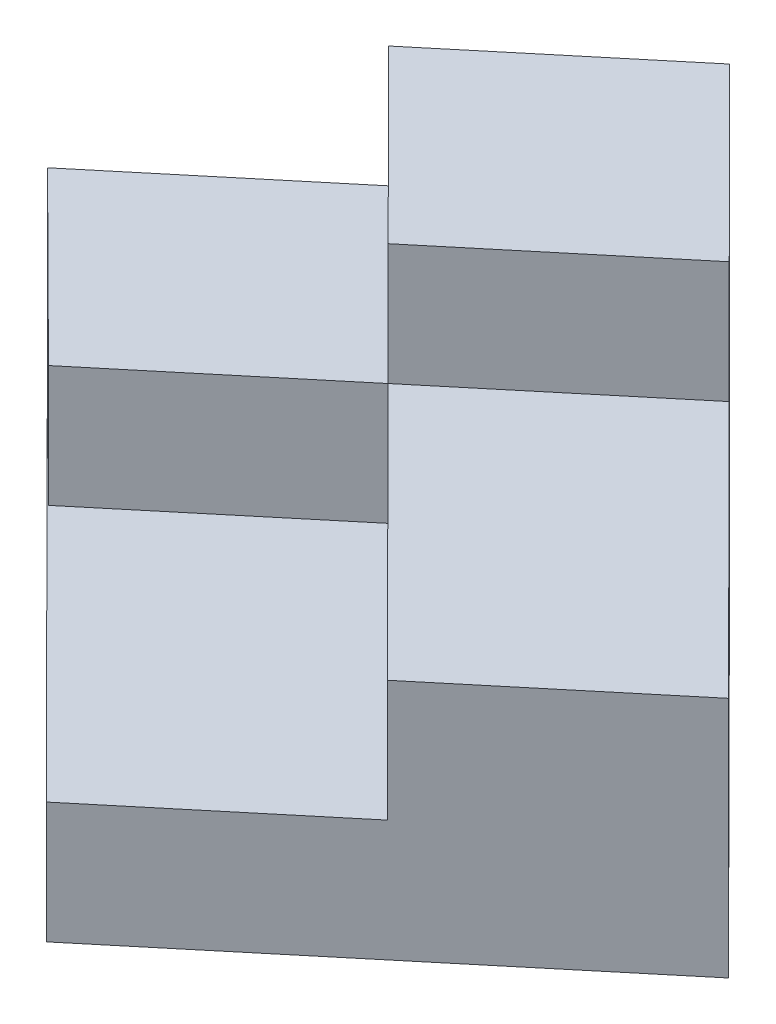
ISO-10303-21;
HEADER;
FILE_DESCRIPTION(('STEP AP214'),'2;1');
FILE_NAME('part.step','',(''),(''),'','','');
FILE_SCHEMA(('AUTOMOTIVE_DESIGN { 1 0 10303 214 1 1 1 1 }'));
ENDSEC;
DATA;
#1=APPLICATION_CONTEXT('core data for automotive mechanical design processes');
#2=APPLICATION_PROTOCOL_DEFINITION('international standard','automotive_design',2000,#1);
#3=PRODUCT_CONTEXT('',#1,'mechanical');
#4=PRODUCT('Part','Part','',(#3));
#5=PRODUCT_RELATED_PRODUCT_CATEGORY('part','',(#4));
#6=PRODUCT_DEFINITION_FORMATION('','',#4);
#7=PRODUCT_DEFINITION_CONTEXT('part definition',#1,'design');
#8=PRODUCT_DEFINITION('design','',#6,#7);
#9=PRODUCT_DEFINITION_SHAPE('','',#8);
#10=(LENGTH_UNIT() NAMED_UNIT(*) SI_UNIT(.MILLI.,.METRE.));
#11=(NAMED_UNIT(*) PLANE_ANGLE_UNIT() SI_UNIT($,.RADIAN.));
#12=(NAMED_UNIT(*) SI_UNIT($,.STERADIAN.) SOLID_ANGLE_UNIT());
#13=UNCERTAINTY_MEASURE_WITH_UNIT(LENGTH_MEASURE(1.E-05),#10,'distance_accuracy_value','');
#14=(GEOMETRIC_REPRESENTATION_CONTEXT(3) GLOBAL_UNCERTAINTY_ASSIGNED_CONTEXT((#13)) GLOBAL_UNIT_ASSIGNED_CONTEXT((#10,
#11,#12)) REPRESENTATION_CONTEXT('',''));
#15=CARTESIAN_POINT('',(0.,0.,0.));
#16=DIRECTION('',(0.,0.,1.));
#17=DIRECTION('',(1.,0.,0.));
#18=AXIS2_PLACEMENT_3D('',#15,#16,#17);
#19=CARTESIAN_POINT('',(0.,10.,0.));
#20=DIRECTION('',(0.,1.,0.));
#21=DIRECTION('',(0.,0.,1.));
#22=AXIS2_PLACEMENT_3D('',#19,#20,#21);
#23=PLANE('',#22);
#24=DIRECTION('',(0.768750532261941,0.,-0.639548762133883));
#25=VECTOR('',#24,1.);
#26=CARTESIAN_POINT('',(35.3021332217309,10.,35.4084649483024));
#27=LINE('',#26,#25);
#28=CARTESIAN_POINT('',(4.55211193125331,10.,60.9904154336578));
#29=VERTEX_POINT('',#28);
#30=CARTESIAN_POINT('',(19.9271225764921,10.,48.1994401909801));
#31=VERTEX_POINT('',#30);
#32=EDGE_CURVE('E55',#29,#31,#27,.T.);
#33=ORIENTED_EDGE('',*,*,#32,.T.);
#34=DIRECTION('',(-0.706042664434619,0.,-0.708169298966048));
#35=VECTOR('',#34,1.);
#36=CARTESIAN_POINT('',(-14.1060842843675,10.,14.063723670901));
#37=LINE('',#36,#35);
#38=CARTESIAN_POINT('',(-1.25966479736122,10.,26.9488371925067));
#39=VERTEX_POINT('',#38);
#40=EDGE_CURVE('E153',#31,#39,#37,.T.);
#41=ORIENTED_EDGE('',*,*,#40,.T.);
#42=DIRECTION('',(0.768750532261941,0.,-0.639548762133883));
#43=VECTOR('',#42,1.);
#44=CARTESIAN_POINT('',(12.7342574194969,10.,15.3068346759609));
#45=LINE('',#44,#43);
#46=CARTESIAN_POINT('',(-16.5694704899519,10.,39.6855662981073));
#47=VERTEX_POINT('',#46);
#48=EDGE_CURVE('E134',#47,#39,#45,.T.);
#49=ORIENTED_EDGE('',*,*,#48,.F.);
#50=DIRECTION('',(0.709027540026287,0.,0.705180790637601));
#51=VECTOR('',#50,1.);
#52=CARTESIAN_POINT('',(-28.0821549409353,10.,28.2353426252656));
#53=LINE('',#52,#51);
#54=CARTESIAN_POINT('',(-30.7500212904776,10.,25.5819504853553));
#55=VERTEX_POINT('',#54);
#56=EDGE_CURVE('E184',#55,#47,#53,.T.);
#57=ORIENTED_EDGE('',*,*,#56,.F.);
#58=DIRECTION('',(0.706042664434619,0.,0.708169298966049));
#59=VECTOR('',#58,1.);
#60=CARTESIAN_POINT('',(-30.7500212904776,10.,25.5819504853553));
#61=LINE('',#60,#59);
#62=EDGE_CURVE('E196',#55,#29,#61,.T.);
#63=ORIENTED_EDGE('',*,*,#62,.T.);
#64=EDGE_LOOP('',(#33,#41,#49,#57,#63));
#65=FACE_BOUND('',#64,.T.);
#66=ADVANCED_FACE('F40',(#65),#23,.T.);
#67=CARTESIAN_POINT('',(12.7342574194969,20.,15.3068346759609));
#68=DIRECTION('',(-0.639548762133883,0.,-0.768750532261941));
#69=DIRECTION('',(-0.768750532261941,0.,0.639548762133883));
#70=AXIS2_PLACEMENT_3D('',#67,#68,#69);
#71=PLANE('',#70);
#72=DIRECTION('',(0.,-1.,0.));
#73=VECTOR('',#72,1.);
#74=CARTESIAN_POINT('',(-1.25966479736122,20.,26.9488371925067));
#75=LINE('',#74,#73);
#76=CARTESIAN_POINT('',(-1.25966479736122,20.,26.9488371925067));
#77=VERTEX_POINT('',#76);
#78=EDGE_CURVE('E149',#77,#39,#75,.T.);
#79=ORIENTED_EDGE('',*,*,#78,.F.);
#80=DIRECTION('',(0.768750532261941,0.,-0.639548762133883));
#81=VECTOR('',#80,1.);
#82=CARTESIAN_POINT('',(12.7342574194969,20.,15.3068346759609));
#83=LINE('',#82,#81);
#84=CARTESIAN_POINT('',(-16.5694704899519,20.,39.6855662981073));
#85=VERTEX_POINT('',#84);
#86=EDGE_CURVE('E137',#85,#77,#83,.T.);
#87=ORIENTED_EDGE('',*,*,#86,.F.);
#88=DIRECTION('',(0.,-1.,0.));
#89=VECTOR('',#88,1.);
#90=CARTESIAN_POINT('',(-16.5694704899519,20.,39.6855662981073));
#91=LINE('',#90,#89);
#92=EDGE_CURVE('E145',#85,#47,#91,.T.);
#93=ORIENTED_EDGE('',*,*,#92,.T.);
#94=ORIENTED_EDGE('',*,*,#48,.T.);
#95=EDGE_LOOP('',(#79,#87,#93,#94));
#96=FACE_BOUND('',#95,.T.);
#97=ADVANCED_FACE('F150',(#96),#71,.F.);
#98=DIRECTION('',(-0.768750532261941,0.,0.639548762133883));
#99=VECTOR('',#98,1.);
#100=CARTESIAN_POINT('',(14.1153458478776,20.,14.157861949829));
#101=LINE('',#100,#99);
#102=CARTESIAN_POINT('',(14.1153458478776,20.,14.157861949829));
#103=VERTEX_POINT('',#102);
#104=EDGE_CURVE('E63',#103,#77,#101,.T.);
#105=ORIENTED_EDGE('',*,*,#104,.F.);
#106=DIRECTION('',(0.,-1.,0.));
#107=VECTOR('',#106,1.);
#108=CARTESIAN_POINT('',(14.1153458478776,30.,14.157861949829));
#109=LINE('',#108,#107);
#110=CARTESIAN_POINT('',(14.1153458478776,30.,14.157861949829));
#111=VERTEX_POINT('',#110);
#112=EDGE_CURVE('E124',#111,#103,#109,.T.);
#113=ORIENTED_EDGE('',*,*,#112,.F.);
#114=DIRECTION('',(0.768750532261941,0.,-0.639548762133883));
#115=VECTOR('',#114,1.);
#116=CARTESIAN_POINT('',(14.1153458478776,30.,14.157861949829));
#117=LINE('',#116,#115);
#118=CARTESIAN_POINT('',(-1.25966479736122,30.,26.9488371925067));
#119=VERTEX_POINT('',#118);
#120=EDGE_CURVE('E120',#119,#111,#117,.T.);
#121=ORIENTED_EDGE('',*,*,#120,.F.);
#122=DIRECTION('',(0.,-1.,0.));
#123=VECTOR('',#122,1.);
#124=CARTESIAN_POINT('',(-1.25966479736122,30.,26.9488371925067));
#125=LINE('',#124,#123);
#126=EDGE_CURVE('E117',#119,#77,#125,.T.);
#127=ORIENTED_EDGE('',*,*,#126,.T.);
#128=EDGE_LOOP('',(#105,#113,#121,#127));
#129=FACE_BOUND('',#128,.T.);
#130=ADVANCED_FACE('F119',(#129),#71,.F.);
#131=CARTESIAN_POINT('',(0.,10.,0.));
#132=DIRECTION('',(0.639548762133883,0.,0.768750532261941));
#133=DIRECTION('',(0.768750532261941,0.,-0.639548762133883));
#134=AXIS2_PLACEMENT_3D('',#131,#132,#133);
#135=PLANE('',#134);
#136=DIRECTION('',(-0.768750532261941,0.,0.639548762133883));
#137=VECTOR('',#136,1.);
#138=CARTESIAN_POINT('',(0.,0.,0.));
#139=LINE('',#138,#137);
#140=CARTESIAN_POINT('',(0.,0.,0.));
#141=VERTEX_POINT('',#140);
#142=CARTESIAN_POINT('',(-30.7500212904776,0.,25.5819504853553));
#143=VERTEX_POINT('',#142);
#144=EDGE_CURVE('E195',#141,#143,#139,.T.);
#145=ORIENTED_EDGE('',*,*,#144,.T.);
#146=DIRECTION('',(0.,-1.,0.));
#147=VECTOR('',#146,1.);
#148=CARTESIAN_POINT('',(-30.7500212904776,10.,25.5819504853553));
#149=LINE('',#148,#147);
#150=EDGE_CURVE('E11',#55,#143,#149,.T.);
#151=ORIENTED_EDGE('',*,*,#150,.F.);
#152=DIRECTION('',(0.,-1.,0.));
#153=VECTOR('',#152,1.);
#154=CARTESIAN_POINT('',(-30.7500212904776,20.,25.5819504853553));
#155=LINE('',#154,#153);
#156=CARTESIAN_POINT('',(-30.7500212904776,20.,25.5819504853553));
#157=VERTEX_POINT('',#156);
#158=EDGE_CURVE('E192',#157,#55,#155,.T.);
#159=ORIENTED_EDGE('',*,*,#158,.F.);
#160=DIRECTION('',(-0.768750532261941,0.,0.639548762133883));
#161=VECTOR('',#160,1.);
#162=CARTESIAN_POINT('',(0.,20.,0.));
#163=LINE('',#162,#161);
#164=CARTESIAN_POINT('',(-15.3750106452388,20.,12.7909752426777));
#165=VERTEX_POINT('',#164);
#166=EDGE_CURVE('E133',#165,#157,#163,.T.);
#167=ORIENTED_EDGE('',*,*,#166,.F.);
#168=DIRECTION('',(0.,-1.,0.));
#169=VECTOR('',#168,1.);
#170=CARTESIAN_POINT('',(-15.3750106452388,30.,12.7909752426777));
#171=LINE('',#170,#169);
#172=CARTESIAN_POINT('',(-15.3750106452388,30.,12.7909752426777));
#173=VERTEX_POINT('',#172);
#174=EDGE_CURVE('E123',#173,#165,#171,.T.);
#175=ORIENTED_EDGE('',*,*,#174,.F.);
#176=DIRECTION('',(-0.768750532261941,0.,0.639548762133883));
#177=VECTOR('',#176,1.);
#178=CARTESIAN_POINT('',(0.,30.,0.));
#179=LINE('',#178,#177);
#180=CARTESIAN_POINT('',(0.,30.,0.));
#181=VERTEX_POINT('',#180);
#182=EDGE_CURVE('E178',#181,#173,#179,.T.);
#183=ORIENTED_EDGE('',*,*,#182,.F.);
#184=DIRECTION('',(0.,-1.,0.));
#185=VECTOR('',#184,1.);
#186=CARTESIAN_POINT('',(0.,10.,0.));
#187=LINE('',#186,#185);
#188=EDGE_CURVE('E200',#181,#141,#187,.T.);
#189=ORIENTED_EDGE('',*,*,#188,.T.);
#190=EDGE_LOOP('',(#145,#151,#159,#167,#175,#183,#189));
#191=FACE_BOUND('',#190,.T.);
#192=ADVANCED_FACE('F42',(#191),#135,.F.);
#193=CARTESIAN_POINT('',(-30.7500212904776,10.,25.5819504853553));
#194=DIRECTION('',(0.708169298966049,0.,-0.706042664434619));
#195=DIRECTION('',(-0.706042664434619,0.,-0.708169298966049));
#196=AXIS2_PLACEMENT_3D('',#193,#194,#195);
#197=PLANE('',#196);
#198=DIRECTION('',(0.706042664434619,0.,0.708169298966049));
#199=VECTOR('',#198,1.);
#200=CARTESIAN_POINT('',(-30.7500212904776,0.,25.5819504853553));
#201=LINE('',#200,#199);
#202=CARTESIAN_POINT('',(4.55211193125331,0.,60.9904154336578));
#203=VERTEX_POINT('',#202);
#204=EDGE_CURVE('E202',#143,#203,#201,.T.);
#205=ORIENTED_EDGE('',*,*,#204,.T.);
#206=DIRECTION('',(0.,-1.,0.));
#207=VECTOR('',#206,1.);
#208=CARTESIAN_POINT('',(4.55211193125331,10.,60.9904154336578));
#209=LINE('',#208,#207);
#210=EDGE_CURVE('E48',#29,#203,#209,.T.);
#211=ORIENTED_EDGE('',*,*,#210,.F.);
#212=ORIENTED_EDGE('',*,*,#62,.F.);
#213=ORIENTED_EDGE('',*,*,#150,.T.);
#214=EDGE_LOOP('',(#205,#211,#212,#213));
#215=FACE_BOUND('',#214,.T.);
#216=ADVANCED_FACE('F253',(#215),#197,.F.);
#217=CARTESIAN_POINT('',(35.3021332217309,10.,35.4084649483024));
#218=DIRECTION('',(-0.639548762133883,0.,-0.768750532261941));
#219=DIRECTION('',(-0.768750532261941,0.,0.639548762133883));
#220=AXIS2_PLACEMENT_3D('',#217,#218,#219);
#221=PLANE('',#220);
#222=DIRECTION('',(0.,-1.,0.));
#223=VECTOR('',#222,1.);
#224=CARTESIAN_POINT('',(35.3021332217309,10.,35.4084649483024));
#225=LINE('',#224,#223);
#226=CARTESIAN_POINT('',(35.3021332217309,20.,35.4084649483024));
#227=VERTEX_POINT('',#226);
#228=CARTESIAN_POINT('',(35.3021332217309,0.,35.4084649483024));
#229=VERTEX_POINT('',#228);
#230=EDGE_CURVE('E209',#227,#229,#225,.T.);
#231=ORIENTED_EDGE('',*,*,#230,.F.);
#232=DIRECTION('',(0.768750532261941,0.,-0.639548762133883));
#233=VECTOR('',#232,1.);
#234=CARTESIAN_POINT('',(35.3021332217309,20.,35.4084649483024));
#235=LINE('',#234,#233);
#236=CARTESIAN_POINT('',(19.9271225764921,20.,48.1994401909801));
#237=VERTEX_POINT('',#236);
#238=EDGE_CURVE('E168',#237,#227,#235,.T.);
#239=ORIENTED_EDGE('',*,*,#238,.F.);
#240=DIRECTION('',(0.,-1.,0.));
#241=VECTOR('',#240,1.);
#242=CARTESIAN_POINT('',(19.9271225764921,20.,48.1994401909801));
#243=LINE('',#242,#241);
#244=EDGE_CURVE('E154',#237,#31,#243,.T.);
#245=ORIENTED_EDGE('',*,*,#244,.T.);
#246=ORIENTED_EDGE('',*,*,#32,.F.);
#247=ORIENTED_EDGE('',*,*,#210,.T.);
#248=DIRECTION('',(0.768750532261941,0.,-0.639548762133883));
#249=VECTOR('',#248,1.);
#250=CARTESIAN_POINT('',(35.3021332217309,0.,35.4084649483024));
#251=LINE('',#250,#249);
#252=EDGE_CURVE('E204',#203,#229,#251,.T.);
#253=ORIENTED_EDGE('',*,*,#252,.T.);
#254=EDGE_LOOP('',(#231,#239,#245,#246,#247,#253));
#255=FACE_BOUND('',#254,.T.);
#256=ADVANCED_FACE('F215',(#255),#221,.F.);
#257=CARTESIAN_POINT('',(0.,10.,0.));
#258=DIRECTION('',(-0.708169298966048,0.,0.706042664434619));
#259=DIRECTION('',(0.706042664434619,0.,0.708169298966049));
#260=AXIS2_PLACEMENT_3D('',#257,#258,#259);
#261=PLANE('',#260);
#262=DIRECTION('',(-0.706042664434619,0.,-0.708169298966048));
#263=VECTOR('',#262,1.);
#264=CARTESIAN_POINT('',(0.,0.,0.));
#265=LINE('',#264,#263);
#266=EDGE_CURVE('E198',#229,#141,#265,.T.);
#267=ORIENTED_EDGE('',*,*,#266,.T.);
#268=ORIENTED_EDGE('',*,*,#188,.F.);
#269=DIRECTION('',(-0.706042664434619,0.,-0.708169298966048));
#270=VECTOR('',#269,1.);
#271=CARTESIAN_POINT('',(0.,30.,0.));
#272=LINE('',#271,#270);
#273=EDGE_CURVE('E175',#111,#181,#272,.T.);
#274=ORIENTED_EDGE('',*,*,#273,.F.);
#275=ORIENTED_EDGE('',*,*,#112,.T.);
#276=DIRECTION('',(-0.706042664434619,0.,-0.708169298966048));
#277=VECTOR('',#276,1.);
#278=CARTESIAN_POINT('',(14.1153458478776,20.,14.157861949829));
#279=LINE('',#278,#277);
#280=EDGE_CURVE('E163',#227,#103,#279,.T.);
#281=ORIENTED_EDGE('',*,*,#280,.F.);
#282=ORIENTED_EDGE('',*,*,#230,.T.);
#283=EDGE_LOOP('',(#267,#268,#274,#275,#281,#282));
#284=FACE_BOUND('',#283,.T.);
#285=ADVANCED_FACE('F224',(#284),#261,.F.);
#286=CARTESIAN_POINT('',(0.,0.,0.));
#287=DIRECTION('',(0.,1.,0.));
#288=DIRECTION('',(0.,0.,1.));
#289=AXIS2_PLACEMENT_3D('',#286,#287,#288);
#290=PLANE('',#289);
#291=ORIENTED_EDGE('',*,*,#144,.F.);
#292=ORIENTED_EDGE('',*,*,#266,.F.);
#293=ORIENTED_EDGE('',*,*,#252,.F.);
#294=ORIENTED_EDGE('',*,*,#204,.F.);
#295=EDGE_LOOP('',(#291,#292,#293,#294));
#296=FACE_BOUND('',#295,.T.);
#297=ADVANCED_FACE('F222',(#296),#290,.F.);
#298=CARTESIAN_POINT('',(-28.0821549409353,20.,28.2353426252656));
#299=DIRECTION('',(0.705180790637601,0.,-0.709027540026287));
#300=DIRECTION('',(-0.709027540026287,0.,-0.705180790637601));
#301=AXIS2_PLACEMENT_3D('',#298,#299,#300);
#302=PLANE('',#301);
#303=ORIENTED_EDGE('',*,*,#56,.T.);
#304=ORIENTED_EDGE('',*,*,#92,.F.);
#305=DIRECTION('',(0.709027540026287,0.,0.705180790637601));
#306=VECTOR('',#305,1.);
#307=CARTESIAN_POINT('',(-28.0821549409353,20.,28.2353426252656));
#308=LINE('',#307,#306);
#309=EDGE_CURVE('E141',#157,#85,#308,.T.);
#310=ORIENTED_EDGE('',*,*,#309,.F.);
#311=ORIENTED_EDGE('',*,*,#158,.T.);
#312=EDGE_LOOP('',(#303,#304,#310,#311));
#313=FACE_BOUND('',#312,.T.);
#314=ADVANCED_FACE('F247',(#313),#302,.F.);
#315=CARTESIAN_POINT('',(0.,20.,0.));
#316=DIRECTION('',(0.,1.,0.));
#317=DIRECTION('',(0.,0.,1.));
#318=AXIS2_PLACEMENT_3D('',#315,#316,#317);
#319=PLANE('',#318);
#320=DIRECTION('',(0.706042664434619,0.,0.708169298966049));
#321=VECTOR('',#320,1.);
#322=CARTESIAN_POINT('',(-14.1060842843675,20.,14.063723670901));
#323=LINE('',#322,#321);
#324=EDGE_CURVE('E128',#165,#77,#323,.T.);
#325=ORIENTED_EDGE('',*,*,#324,.F.);
#326=ORIENTED_EDGE('',*,*,#166,.T.);
#327=ORIENTED_EDGE('',*,*,#309,.T.);
#328=ORIENTED_EDGE('',*,*,#86,.T.);
#329=EDGE_LOOP('',(#325,#326,#327,#328));
#330=FACE_BOUND('',#329,.T.);
#331=ADVANCED_FACE('F139',(#330),#319,.T.);
#332=CARTESIAN_POINT('',(-15.3750106452388,30.,12.7909752426777));
#333=DIRECTION('',(0.708169298966048,0.,-0.706042664434619));
#334=DIRECTION('',(-0.706042664434619,0.,-0.708169298966049));
#335=AXIS2_PLACEMENT_3D('',#332,#333,#334);
#336=PLANE('',#335);
#337=ORIENTED_EDGE('',*,*,#324,.T.);
#338=ORIENTED_EDGE('',*,*,#126,.F.);
#339=DIRECTION('',(0.706042664434619,0.,0.708169298966048));
#340=VECTOR('',#339,1.);
#341=CARTESIAN_POINT('',(-15.3750106452388,30.,12.7909752426777));
#342=LINE('',#341,#340);
#343=EDGE_CURVE('E180',#173,#119,#342,.T.);
#344=ORIENTED_EDGE('',*,*,#343,.F.);
#345=ORIENTED_EDGE('',*,*,#174,.T.);
#346=EDGE_LOOP('',(#337,#338,#344,#345));
#347=FACE_BOUND('',#346,.T.);
#348=ADVANCED_FACE('F130',(#347),#336,.F.);
#349=CARTESIAN_POINT('',(0.,30.,0.));
#350=DIRECTION('',(0.,-1.,0.));
#351=DIRECTION('',(0.,0.,-1.));
#352=AXIS2_PLACEMENT_3D('',#349,#350,#351);
#353=PLANE('',#352);
#354=ORIENTED_EDGE('',*,*,#273,.T.);
#355=ORIENTED_EDGE('',*,*,#182,.T.);
#356=ORIENTED_EDGE('',*,*,#343,.T.);
#357=ORIENTED_EDGE('',*,*,#120,.T.);
#358=EDGE_LOOP('',(#354,#355,#356,#357));
#359=FACE_BOUND('',#358,.T.);
#360=ADVANCED_FACE('F230',(#359),#353,.F.);
#361=CARTESIAN_POINT('',(-1.25966479736122,20.,26.9488371925067));
#362=DIRECTION('',(0.708169298966048,0.,-0.706042664434619));
#363=DIRECTION('',(-0.706042664434619,0.,-0.708169298966048));
#364=AXIS2_PLACEMENT_3D('',#361,#362,#363);
#365=PLANE('',#364);
#366=ORIENTED_EDGE('',*,*,#40,.F.);
#367=ORIENTED_EDGE('',*,*,#244,.F.);
#368=DIRECTION('',(0.706042664434619,0.,0.708169298966048));
#369=VECTOR('',#368,1.);
#370=CARTESIAN_POINT('',(-1.25966479736122,20.,26.9488371925067));
#371=LINE('',#370,#369);
#372=EDGE_CURVE('E160',#77,#237,#371,.T.);
#373=ORIENTED_EDGE('',*,*,#372,.F.);
#374=ORIENTED_EDGE('',*,*,#78,.T.);
#375=EDGE_LOOP('',(#366,#367,#373,#374));
#376=FACE_BOUND('',#375,.T.);
#377=ADVANCED_FACE('F165',(#376),#365,.F.);
#378=CARTESIAN_POINT('',(0.,20.,0.));
#379=DIRECTION('',(0.,-1.,0.));
#380=DIRECTION('',(0.,0.,-1.));
#381=AXIS2_PLACEMENT_3D('',#378,#379,#380);
#382=PLANE('',#381);
#383=ORIENTED_EDGE('',*,*,#280,.T.);
#384=ORIENTED_EDGE('',*,*,#104,.T.);
#385=ORIENTED_EDGE('',*,*,#372,.T.);
#386=ORIENTED_EDGE('',*,*,#238,.T.);
#387=EDGE_LOOP('',(#383,#384,#385,#386));
#388=FACE_BOUND('',#387,.T.);
#389=ADVANCED_FACE('F158',(#388),#382,.F.);
#390=CLOSED_SHELL('',(#66,#97,#130,#192,#216,#256,#285,#297,#314,#331,#348,#360,#377,#389));
#391=MANIFOLD_SOLID_BREP('B2',#390);
#392=ADVANCED_BREP_SHAPE_REPRESENTATION('',(#18,#391),#14);
#393=SHAPE_DEFINITION_REPRESENTATION(#9,#392);
ENDSEC;
END-ISO-10303-21;
